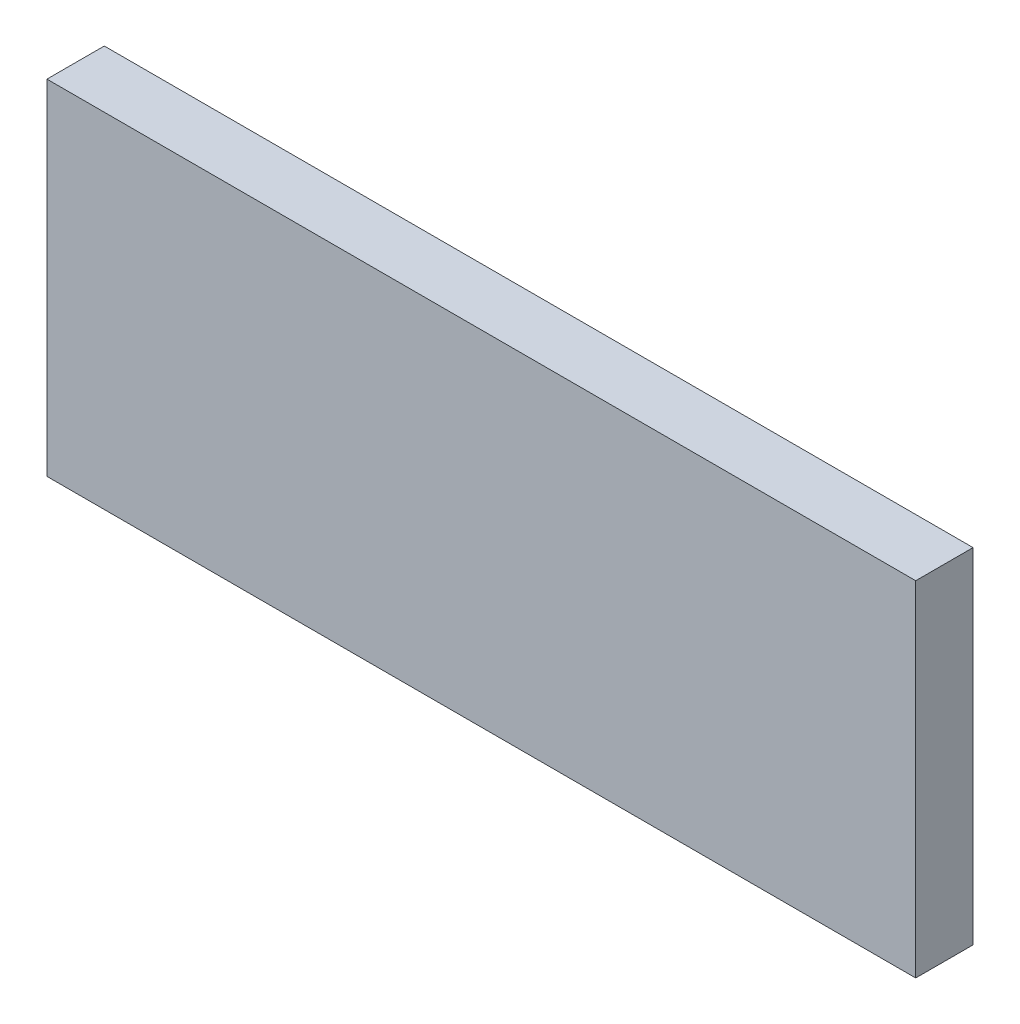
ISO-10303-21;
HEADER;
FILE_DESCRIPTION(('STEP AP214'),'2;1');
FILE_NAME('part.step','',(''),(''),'','','');
FILE_SCHEMA(('AUTOMOTIVE_DESIGN { 1 0 10303 214 1 1 1 1 }'));
ENDSEC;
DATA;
#1=APPLICATION_CONTEXT('core data for automotive mechanical design processes');
#2=APPLICATION_PROTOCOL_DEFINITION('international standard','automotive_design',2000,#1);
#3=PRODUCT_CONTEXT('',#1,'mechanical');
#4=PRODUCT('Part','Part','',(#3));
#5=PRODUCT_RELATED_PRODUCT_CATEGORY('part','',(#4));
#6=PRODUCT_DEFINITION_FORMATION('','',#4);
#7=PRODUCT_DEFINITION_CONTEXT('part definition',#1,'design');
#8=PRODUCT_DEFINITION('design','',#6,#7);
#9=PRODUCT_DEFINITION_SHAPE('','',#8);
#10=(LENGTH_UNIT() NAMED_UNIT(*) SI_UNIT(.MILLI.,.METRE.));
#11=(NAMED_UNIT(*) PLANE_ANGLE_UNIT() SI_UNIT($,.RADIAN.));
#12=(NAMED_UNIT(*) SI_UNIT($,.STERADIAN.) SOLID_ANGLE_UNIT());
#13=UNCERTAINTY_MEASURE_WITH_UNIT(LENGTH_MEASURE(1.E-05),#10,'distance_accuracy_value','');
#14=(GEOMETRIC_REPRESENTATION_CONTEXT(3) GLOBAL_UNCERTAINTY_ASSIGNED_CONTEXT((#13)) GLOBAL_UNIT_ASSIGNED_CONTEXT((#10,
#11,#12)) REPRESENTATION_CONTEXT('',''));
#15=CARTESIAN_POINT('',(0.,0.,0.));
#16=DIRECTION('',(0.,0.,1.));
#17=DIRECTION('',(1.,0.,0.));
#18=AXIS2_PLACEMENT_3D('',#15,#16,#17);
#19=CARTESIAN_POINT('',(343.499999999994,140.,-10.0000000000001));
#20=DIRECTION('',(1.,0.,0.));
#21=DIRECTION('',(0.,0.,-1.));
#22=AXIS2_PLACEMENT_3D('',#19,#20,#21);
#23=PLANE('',#22);
#24=DIRECTION('',(0.,0.,1.));
#25=VECTOR('',#24,1.);
#26=CARTESIAN_POINT('',(343.499999999994,20.,-10.0000000000001));
#27=LINE('',#26,#25);
#28=CARTESIAN_POINT('',(343.499999999994,20.,-10.0000000000001));
#29=VERTEX_POINT('',#28);
#30=CARTESIAN_POINT('',(343.499999999994,20.,9.99999999999573));
#31=VERTEX_POINT('',#30);
#32=EDGE_CURVE('E104',#29,#31,#27,.T.);
#33=ORIENTED_EDGE('',*,*,#32,.T.);
#34=DIRECTION('',(0.,-1.,0.));
#35=VECTOR('',#34,1.);
#36=CARTESIAN_POINT('',(343.499999999994,140.,9.99999999999573));
#37=LINE('',#36,#35);
#38=CARTESIAN_POINT('',(343.499999999994,140.,9.99999999999573));
#39=VERTEX_POINT('',#38);
#40=EDGE_CURVE('E11',#39,#31,#37,.T.);
#41=ORIENTED_EDGE('',*,*,#40,.F.);
#42=DIRECTION('',(0.,0.,1.));
#43=VECTOR('',#42,1.);
#44=CARTESIAN_POINT('',(343.499999999994,140.,-10.0000000000001));
#45=LINE('',#44,#43);
#46=CARTESIAN_POINT('',(343.499999999994,140.,-10.0000000000001));
#47=VERTEX_POINT('',#46);
#48=EDGE_CURVE('E92',#47,#39,#45,.T.);
#49=ORIENTED_EDGE('',*,*,#48,.F.);
#50=DIRECTION('',(0.,-1.,0.));
#51=VECTOR('',#50,1.);
#52=CARTESIAN_POINT('',(343.499999999994,140.,-10.0000000000001));
#53=LINE('',#52,#51);
#54=EDGE_CURVE('E100',#47,#29,#53,.T.);
#55=ORIENTED_EDGE('',*,*,#54,.T.);
#56=EDGE_LOOP('',(#33,#41,#49,#55));
#57=FACE_BOUND('',#56,.T.);
#58=ADVANCED_FACE('F41',(#57),#23,.F.);
#59=CARTESIAN_POINT('',(646.499999999994,140.,9.9999999999957));
#60=DIRECTION('',(0.,0.,-1.));
#61=DIRECTION('',(-1.,0.,0.));
#62=AXIS2_PLACEMENT_3D('',#59,#60,#61);
#63=PLANE('',#62);
#64=DIRECTION('',(1.,0.,0.));
#65=VECTOR('',#64,1.);
#66=CARTESIAN_POINT('',(646.499999999994,20.,9.9999999999957));
#67=LINE('',#66,#65);
#68=CARTESIAN_POINT('',(646.499999999994,20.,9.9999999999957));
#69=VERTEX_POINT('',#68);
#70=EDGE_CURVE('E96',#31,#69,#67,.T.);
#71=ORIENTED_EDGE('',*,*,#70,.T.);
#72=DIRECTION('',(0.,-1.,0.));
#73=VECTOR('',#72,1.);
#74=CARTESIAN_POINT('',(646.499999999994,140.,9.9999999999957));
#75=LINE('',#74,#73);
#76=CARTESIAN_POINT('',(646.499999999994,140.,9.9999999999957));
#77=VERTEX_POINT('',#76);
#78=EDGE_CURVE('E49',#77,#69,#75,.T.);
#79=ORIENTED_EDGE('',*,*,#78,.F.);
#80=DIRECTION('',(1.,0.,0.));
#81=VECTOR('',#80,1.);
#82=CARTESIAN_POINT('',(646.499999999994,140.,9.9999999999957));
#83=LINE('',#82,#81);
#84=EDGE_CURVE('E87',#39,#77,#83,.T.);
#85=ORIENTED_EDGE('',*,*,#84,.F.);
#86=ORIENTED_EDGE('',*,*,#40,.T.);
#87=EDGE_LOOP('',(#71,#79,#85,#86));
#88=FACE_BOUND('',#87,.T.);
#89=ADVANCED_FACE('F95',(#88),#63,.F.);
#90=CARTESIAN_POINT('',(646.499999999994,140.,-10.0000000000001));
#91=DIRECTION('',(-1.,0.,0.));
#92=DIRECTION('',(0.,0.,1.));
#93=AXIS2_PLACEMENT_3D('',#90,#91,#92);
#94=PLANE('',#93);
#95=DIRECTION('',(0.,0.,-1.));
#96=VECTOR('',#95,1.);
#97=CARTESIAN_POINT('',(646.499999999994,20.,-10.0000000000001));
#98=LINE('',#97,#96);
#99=CARTESIAN_POINT('',(646.499999999994,20.,-10.0000000000001));
#100=VERTEX_POINT('',#99);
#101=EDGE_CURVE('E74',#69,#100,#98,.T.);
#102=ORIENTED_EDGE('',*,*,#101,.T.);
#103=DIRECTION('',(0.,-1.,0.));
#104=VECTOR('',#103,1.);
#105=CARTESIAN_POINT('',(646.499999999994,140.,-10.0000000000001));
#106=LINE('',#105,#104);
#107=CARTESIAN_POINT('',(646.499999999994,140.,-10.0000000000001));
#108=VERTEX_POINT('',#107);
#109=EDGE_CURVE('E97',#108,#100,#106,.T.);
#110=ORIENTED_EDGE('',*,*,#109,.F.);
#111=DIRECTION('',(0.,0.,-1.));
#112=VECTOR('',#111,1.);
#113=CARTESIAN_POINT('',(646.499999999994,140.,-10.0000000000001));
#114=LINE('',#113,#112);
#115=EDGE_CURVE('E90',#77,#108,#114,.T.);
#116=ORIENTED_EDGE('',*,*,#115,.F.);
#117=ORIENTED_EDGE('',*,*,#78,.T.);
#118=EDGE_LOOP('',(#102,#110,#116,#117));
#119=FACE_BOUND('',#118,.T.);
#120=ADVANCED_FACE('F98',(#119),#94,.F.);
#121=CARTESIAN_POINT('',(343.499999999994,140.,-10.0000000000001));
#122=DIRECTION('',(0.,0.,1.));
#123=DIRECTION('',(1.,0.,0.));
#124=AXIS2_PLACEMENT_3D('',#121,#122,#123);
#125=PLANE('',#124);
#126=DIRECTION('',(-1.,0.,0.));
#127=VECTOR('',#126,1.);
#128=CARTESIAN_POINT('',(343.499999999994,20.,-10.0000000000001));
#129=LINE('',#128,#127);
#130=EDGE_CURVE('E80',#100,#29,#129,.T.);
#131=ORIENTED_EDGE('',*,*,#130,.T.);
#132=ORIENTED_EDGE('',*,*,#54,.F.);
#133=DIRECTION('',(-1.,0.,0.));
#134=VECTOR('',#133,1.);
#135=CARTESIAN_POINT('',(343.499999999994,140.,-10.0000000000001));
#136=LINE('',#135,#134);
#137=EDGE_CURVE('E57',#108,#47,#136,.T.);
#138=ORIENTED_EDGE('',*,*,#137,.F.);
#139=ORIENTED_EDGE('',*,*,#109,.T.);
#140=EDGE_LOOP('',(#131,#132,#138,#139));
#141=FACE_BOUND('',#140,.T.);
#142=ADVANCED_FACE('F111',(#141),#125,.F.);
#143=CARTESIAN_POINT('',(0.,140.,0.));
#144=DIRECTION('',(0.,-1.,0.));
#145=DIRECTION('',(0.,0.,-1.));
#146=AXIS2_PLACEMENT_3D('',#143,#144,#145);
#147=PLANE('',#146);
#148=ORIENTED_EDGE('',*,*,#48,.T.);
#149=ORIENTED_EDGE('',*,*,#84,.T.);
#150=ORIENTED_EDGE('',*,*,#115,.T.);
#151=ORIENTED_EDGE('',*,*,#137,.T.);
#152=EDGE_LOOP('',(#148,#149,#150,#151));
#153=FACE_BOUND('',#152,.T.);
#154=ADVANCED_FACE('F88',(#153),#147,.F.);
#155=CARTESIAN_POINT('',(0.,20.,0.));
#156=DIRECTION('',(0.,-1.,0.));
#157=DIRECTION('',(0.,0.,-1.));
#158=AXIS2_PLACEMENT_3D('',#155,#156,#157);
#159=PLANE('',#158);
#160=ORIENTED_EDGE('',*,*,#32,.F.);
#161=ORIENTED_EDGE('',*,*,#130,.F.);
#162=ORIENTED_EDGE('',*,*,#101,.F.);
#163=ORIENTED_EDGE('',*,*,#70,.F.);
#164=EDGE_LOOP('',(#160,#161,#162,#163));
#165=FACE_BOUND('',#164,.T.);
#166=ADVANCED_FACE('F114',(#165),#159,.T.);
#167=CLOSED_SHELL('',(#58,#89,#120,#142,#154,#166));
#168=MANIFOLD_SOLID_BREP('B2',#167);
#169=ADVANCED_BREP_SHAPE_REPRESENTATION('',(#18,#168),#14);
#170=SHAPE_DEFINITION_REPRESENTATION(#9,#169);
ENDSEC;
END-ISO-10303-21;
